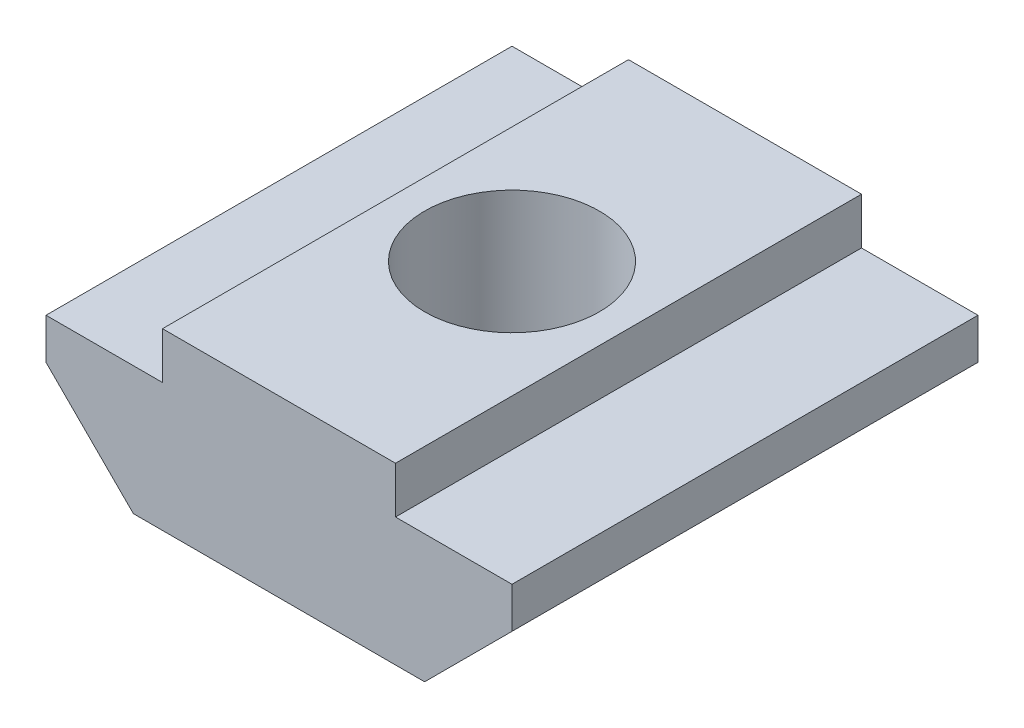
ISO-10303-21;
HEADER;
FILE_DESCRIPTION(('STEP AP214'),'2;1');
FILE_NAME('part.step','',(''),(''),'','','');
FILE_SCHEMA(('AUTOMOTIVE_DESIGN { 1 0 10303 214 1 1 1 1 }'));
ENDSEC;
DATA;
#1=APPLICATION_CONTEXT('core data for automotive mechanical design processes');
#2=APPLICATION_PROTOCOL_DEFINITION('international standard','automotive_design',2000,#1);
#3=PRODUCT_CONTEXT('',#1,'mechanical');
#4=PRODUCT('Part','Part','',(#3));
#5=PRODUCT_RELATED_PRODUCT_CATEGORY('part','',(#4));
#6=PRODUCT_DEFINITION_FORMATION('','',#4);
#7=PRODUCT_DEFINITION_CONTEXT('part definition',#1,'design');
#8=PRODUCT_DEFINITION('design','',#6,#7);
#9=PRODUCT_DEFINITION_SHAPE('','',#8);
#10=(LENGTH_UNIT() NAMED_UNIT(*) SI_UNIT(.MILLI.,.METRE.));
#11=(NAMED_UNIT(*) PLANE_ANGLE_UNIT() SI_UNIT($,.RADIAN.));
#12=(NAMED_UNIT(*) SI_UNIT($,.STERADIAN.) SOLID_ANGLE_UNIT());
#13=UNCERTAINTY_MEASURE_WITH_UNIT(LENGTH_MEASURE(1.E-05),#10,'distance_accuracy_value','');
#14=(GEOMETRIC_REPRESENTATION_CONTEXT(3) GLOBAL_UNCERTAINTY_ASSIGNED_CONTEXT((#13)) GLOBAL_UNIT_ASSIGNED_CONTEXT((#10,
#11,#12)) REPRESENTATION_CONTEXT('',''));
#15=CARTESIAN_POINT('',(0.,0.,0.));
#16=DIRECTION('',(0.,0.,1.));
#17=DIRECTION('',(1.,0.,0.));
#18=AXIS2_PLACEMENT_3D('',#15,#16,#17);
#19=CARTESIAN_POINT('',(-5.00000000000001,-4.4,16.));
#20=DIRECTION('',(0.707106781186549,0.707106781186546,0.));
#21=DIRECTION('',(-0.707106781186546,0.707106781186549,0.));
#22=AXIS2_PLACEMENT_3D('',#19,#20,#21);
#23=PLANE('',#22);
#24=DIRECTION('',(0.707106781186546,-0.707106781186549,0.));
#25=VECTOR('',#24,1.);
#26=CARTESIAN_POINT('',(-5.00000000000001,-4.4,0.));
#27=LINE('',#26,#25);
#28=CARTESIAN_POINT('',(-8.,-1.4,0.));
#29=VERTEX_POINT('',#28);
#30=CARTESIAN_POINT('',(-5.00000000000001,-4.4,0.));
#31=VERTEX_POINT('',#30);
#32=EDGE_CURVE('E143',#29,#31,#27,.T.);
#33=ORIENTED_EDGE('',*,*,#32,.T.);
#34=DIRECTION('',(0.,0.,-1.));
#35=VECTOR('',#34,1.);
#36=CARTESIAN_POINT('',(-5.00000000000001,-4.4,16.));
#37=LINE('',#36,#35);
#38=CARTESIAN_POINT('',(-5.00000000000001,-4.4,16.));
#39=VERTEX_POINT('',#38);
#40=EDGE_CURVE('E11',#39,#31,#37,.T.);
#41=ORIENTED_EDGE('',*,*,#40,.F.);
#42=DIRECTION('',(0.707106781186546,-0.707106781186549,0.));
#43=VECTOR('',#42,1.);
#44=CARTESIAN_POINT('',(-5.00000000000001,-4.4,16.));
#45=LINE('',#44,#43);
#46=CARTESIAN_POINT('',(-8.,-1.4,16.));
#47=VERTEX_POINT('',#46);
#48=EDGE_CURVE('E162',#47,#39,#45,.T.);
#49=ORIENTED_EDGE('',*,*,#48,.F.);
#50=DIRECTION('',(0.,0.,-1.));
#51=VECTOR('',#50,1.);
#52=CARTESIAN_POINT('',(-8.,-1.4,16.));
#53=LINE('',#52,#51);
#54=EDGE_CURVE('E139',#47,#29,#53,.T.);
#55=ORIENTED_EDGE('',*,*,#54,.T.);
#56=EDGE_LOOP('',(#33,#41,#49,#55));
#57=FACE_BOUND('',#56,.T.);
#58=ADVANCED_FACE('F35',(#57),#23,.F.);
#59=CARTESIAN_POINT('',(5.00000000000001,-4.4,16.));
#60=DIRECTION('',(0.,1.,0.));
#61=DIRECTION('',(-1.,0.,0.));
#62=AXIS2_PLACEMENT_3D('',#59,#60,#61);
#63=PLANE('',#62);
#64=CARTESIAN_POINT('',(0.,-4.4,8.));
#65=DIRECTION('',(0.,1.,0.));
#66=DIRECTION('',(0.,0.,1.));
#67=AXIS2_PLACEMENT_3D('',#64,#65,#66);
#68=CIRCLE('',#67,3.);
#69=CARTESIAN_POINT('',(0.,-4.4,11.));
#70=VERTEX_POINT('',#69);
#71=EDGE_CURVE('E147',#70,#70,#68,.T.);
#72=ORIENTED_EDGE('',*,*,#71,.T.);
#73=EDGE_LOOP('',(#72));
#74=FACE_BOUND('',#73,.T.);
#75=DIRECTION('',(1.,0.,0.));
#76=VECTOR('',#75,1.);
#77=CARTESIAN_POINT('',(5.00000000000001,-4.4,0.));
#78=LINE('',#77,#76);
#79=CARTESIAN_POINT('',(5.00000000000001,-4.4,0.));
#80=VERTEX_POINT('',#79);
#81=EDGE_CURVE('E146',#31,#80,#78,.T.);
#82=ORIENTED_EDGE('',*,*,#81,.T.);
#83=DIRECTION('',(0.,0.,-1.));
#84=VECTOR('',#83,1.);
#85=CARTESIAN_POINT('',(5.00000000000001,-4.4,16.));
#86=LINE('',#85,#84);
#87=CARTESIAN_POINT('',(5.00000000000001,-4.4,16.));
#88=VERTEX_POINT('',#87);
#89=EDGE_CURVE('E43',#88,#80,#86,.T.);
#90=ORIENTED_EDGE('',*,*,#89,.F.);
#91=DIRECTION('',(1.,0.,0.));
#92=VECTOR('',#91,1.);
#93=CARTESIAN_POINT('',(5.00000000000001,-4.4,16.));
#94=LINE('',#93,#92);
#95=EDGE_CURVE('E100',#39,#88,#94,.T.);
#96=ORIENTED_EDGE('',*,*,#95,.F.);
#97=ORIENTED_EDGE('',*,*,#40,.T.);
#98=EDGE_LOOP('',(#82,#90,#96,#97));
#99=FACE_BOUND('',#98,.T.);
#100=ADVANCED_FACE('F238',(#74,#99),#63,.F.);
#101=CARTESIAN_POINT('',(5.00000000000001,-4.4,16.));
#102=DIRECTION('',(-0.707106781186549,0.707106781186546,0.));
#103=DIRECTION('',(-0.707106781186546,-0.707106781186549,0.));
#104=AXIS2_PLACEMENT_3D('',#101,#102,#103);
#105=PLANE('',#104);
#106=DIRECTION('',(0.707106781186546,0.707106781186549,0.));
#107=VECTOR('',#106,1.);
#108=CARTESIAN_POINT('',(5.00000000000001,-4.4,0.));
#109=LINE('',#108,#107);
#110=CARTESIAN_POINT('',(8.,-1.4,0.));
#111=VERTEX_POINT('',#110);
#112=EDGE_CURVE('E149',#80,#111,#109,.T.);
#113=ORIENTED_EDGE('',*,*,#112,.T.);
#114=DIRECTION('',(0.,0.,-1.));
#115=VECTOR('',#114,1.);
#116=CARTESIAN_POINT('',(8.,-1.4,16.));
#117=LINE('',#116,#115);
#118=CARTESIAN_POINT('',(8.,-1.4,16.));
#119=VERTEX_POINT('',#118);
#120=EDGE_CURVE('E175',#119,#111,#117,.T.);
#121=ORIENTED_EDGE('',*,*,#120,.F.);
#122=DIRECTION('',(0.707106781186546,0.707106781186549,0.));
#123=VECTOR('',#122,1.);
#124=CARTESIAN_POINT('',(5.00000000000001,-4.4,16.));
#125=LINE('',#124,#123);
#126=EDGE_CURVE('E183',#88,#119,#125,.T.);
#127=ORIENTED_EDGE('',*,*,#126,.F.);
#128=ORIENTED_EDGE('',*,*,#89,.T.);
#129=EDGE_LOOP('',(#113,#121,#127,#128));
#130=FACE_BOUND('',#129,.T.);
#131=ADVANCED_FACE('F181',(#130),#105,.F.);
#132=CARTESIAN_POINT('',(8.,-1.4,16.));
#133=DIRECTION('',(-1.,0.,0.));
#134=DIRECTION('',(0.,0.,1.));
#135=AXIS2_PLACEMENT_3D('',#132,#133,#134);
#136=PLANE('',#135);
#137=DIRECTION('',(0.,1.,0.));
#138=VECTOR('',#137,1.);
#139=CARTESIAN_POINT('',(8.,-1.4,0.));
#140=LINE('',#139,#138);
#141=CARTESIAN_POINT('',(8.,0.,0.));
#142=VERTEX_POINT('',#141);
#143=EDGE_CURVE('E151',#111,#142,#140,.T.);
#144=ORIENTED_EDGE('',*,*,#143,.T.);
#145=DIRECTION('',(0.,0.,-1.));
#146=VECTOR('',#145,1.);
#147=CARTESIAN_POINT('',(8.,0.,16.));
#148=LINE('',#147,#146);
#149=CARTESIAN_POINT('',(8.,0.,16.));
#150=VERTEX_POINT('',#149);
#151=EDGE_CURVE('E172',#150,#142,#148,.T.);
#152=ORIENTED_EDGE('',*,*,#151,.F.);
#153=DIRECTION('',(0.,1.,0.));
#154=VECTOR('',#153,1.);
#155=CARTESIAN_POINT('',(8.,-1.4,16.));
#156=LINE('',#155,#154);
#157=EDGE_CURVE('E201',#119,#150,#156,.T.);
#158=ORIENTED_EDGE('',*,*,#157,.F.);
#159=ORIENTED_EDGE('',*,*,#120,.T.);
#160=EDGE_LOOP('',(#144,#152,#158,#159));
#161=FACE_BOUND('',#160,.T.);
#162=ADVANCED_FACE('F192',(#161),#136,.F.);
#163=CARTESIAN_POINT('',(8.,0.,16.));
#164=DIRECTION('',(0.,-1.,0.));
#165=DIRECTION('',(1.,0.,0.));
#166=AXIS2_PLACEMENT_3D('',#163,#164,#165);
#167=PLANE('',#166);
#168=DIRECTION('',(-1.,0.,0.));
#169=VECTOR('',#168,1.);
#170=CARTESIAN_POINT('',(8.,0.,0.));
#171=LINE('',#170,#169);
#172=CARTESIAN_POINT('',(4.,0.,0.));
#173=VERTEX_POINT('',#172);
#174=EDGE_CURVE('E153',#142,#173,#171,.T.);
#175=ORIENTED_EDGE('',*,*,#174,.T.);
#176=DIRECTION('',(0.,0.,-1.));
#177=VECTOR('',#176,1.);
#178=CARTESIAN_POINT('',(4.,0.,16.));
#179=LINE('',#178,#177);
#180=CARTESIAN_POINT('',(4.,0.,16.));
#181=VERTEX_POINT('',#180);
#182=EDGE_CURVE('E169',#181,#173,#179,.T.);
#183=ORIENTED_EDGE('',*,*,#182,.F.);
#184=DIRECTION('',(-1.,0.,0.));
#185=VECTOR('',#184,1.);
#186=CARTESIAN_POINT('',(8.,0.,16.));
#187=LINE('',#186,#185);
#188=EDGE_CURVE('E198',#150,#181,#187,.T.);
#189=ORIENTED_EDGE('',*,*,#188,.F.);
#190=ORIENTED_EDGE('',*,*,#151,.T.);
#191=EDGE_LOOP('',(#175,#183,#189,#190));
#192=FACE_BOUND('',#191,.T.);
#193=ADVANCED_FACE('F196',(#192),#167,.F.);
#194=CARTESIAN_POINT('',(4.,0.,16.));
#195=DIRECTION('',(-1.,0.,0.));
#196=DIRECTION('',(0.,-1.,0.));
#197=AXIS2_PLACEMENT_3D('',#194,#195,#196);
#198=PLANE('',#197);
#199=DIRECTION('',(0.,1.,0.));
#200=VECTOR('',#199,1.);
#201=CARTESIAN_POINT('',(4.,0.,0.));
#202=LINE('',#201,#200);
#203=CARTESIAN_POINT('',(4.,1.6,0.));
#204=VERTEX_POINT('',#203);
#205=EDGE_CURVE('E155',#173,#204,#202,.T.);
#206=ORIENTED_EDGE('',*,*,#205,.T.);
#207=DIRECTION('',(0.,0.,-1.));
#208=VECTOR('',#207,1.);
#209=CARTESIAN_POINT('',(4.,1.6,16.));
#210=LINE('',#209,#208);
#211=CARTESIAN_POINT('',(4.,1.6,16.));
#212=VERTEX_POINT('',#211);
#213=EDGE_CURVE('E166',#212,#204,#210,.T.);
#214=ORIENTED_EDGE('',*,*,#213,.F.);
#215=DIRECTION('',(0.,1.,0.));
#216=VECTOR('',#215,1.);
#217=CARTESIAN_POINT('',(4.,0.,16.));
#218=LINE('',#217,#216);
#219=EDGE_CURVE('E200',#181,#212,#218,.T.);
#220=ORIENTED_EDGE('',*,*,#219,.F.);
#221=ORIENTED_EDGE('',*,*,#182,.T.);
#222=EDGE_LOOP('',(#206,#214,#220,#221));
#223=FACE_BOUND('',#222,.T.);
#224=ADVANCED_FACE('F220',(#223),#198,.F.);
#225=CARTESIAN_POINT('',(-4.,1.6,16.));
#226=DIRECTION('',(0.,-1.,0.));
#227=DIRECTION('',(1.,0.,0.));
#228=AXIS2_PLACEMENT_3D('',#225,#226,#227);
#229=PLANE('',#228);
#230=CARTESIAN_POINT('',(0.,1.6,8.));
#231=DIRECTION('',(0.,1.,0.));
#232=DIRECTION('',(0.,0.,1.));
#233=AXIS2_PLACEMENT_3D('',#230,#231,#232);
#234=CIRCLE('',#233,3.);
#235=CARTESIAN_POINT('',(0.,1.6,11.));
#236=VERTEX_POINT('',#235);
#237=EDGE_CURVE('E211',#236,#236,#234,.T.);
#238=ORIENTED_EDGE('',*,*,#237,.F.);
#239=EDGE_LOOP('',(#238));
#240=FACE_BOUND('',#239,.T.);
#241=DIRECTION('',(-1.,0.,0.));
#242=VECTOR('',#241,1.);
#243=CARTESIAN_POINT('',(-4.,1.6,0.));
#244=LINE('',#243,#242);
#245=CARTESIAN_POINT('',(-4.,1.6,0.));
#246=VERTEX_POINT('',#245);
#247=EDGE_CURVE('E157',#204,#246,#244,.T.);
#248=ORIENTED_EDGE('',*,*,#247,.T.);
#249=DIRECTION('',(0.,0.,-1.));
#250=VECTOR('',#249,1.);
#251=CARTESIAN_POINT('',(-4.,1.6,16.));
#252=LINE('',#251,#250);
#253=CARTESIAN_POINT('',(-4.,1.6,16.));
#254=VERTEX_POINT('',#253);
#255=EDGE_CURVE('E134',#254,#246,#252,.T.);
#256=ORIENTED_EDGE('',*,*,#255,.F.);
#257=DIRECTION('',(-1.,0.,0.));
#258=VECTOR('',#257,1.);
#259=CARTESIAN_POINT('',(-4.,1.6,16.));
#260=LINE('',#259,#258);
#261=EDGE_CURVE('E125',#212,#254,#260,.T.);
#262=ORIENTED_EDGE('',*,*,#261,.F.);
#263=ORIENTED_EDGE('',*,*,#213,.T.);
#264=EDGE_LOOP('',(#248,#256,#262,#263));
#265=FACE_BOUND('',#264,.T.);
#266=ADVANCED_FACE('F217',(#240,#265),#229,.F.);
#267=CARTESIAN_POINT('',(-4.,0.,16.));
#268=DIRECTION('',(1.,0.,0.));
#269=DIRECTION('',(0.,0.,-1.));
#270=AXIS2_PLACEMENT_3D('',#267,#268,#269);
#271=PLANE('',#270);
#272=DIRECTION('',(0.,-1.,0.));
#273=VECTOR('',#272,1.);
#274=CARTESIAN_POINT('',(-4.,0.,0.));
#275=LINE('',#274,#273);
#276=CARTESIAN_POINT('',(-4.,0.,0.));
#277=VERTEX_POINT('',#276);
#278=EDGE_CURVE('E133',#246,#277,#275,.T.);
#279=ORIENTED_EDGE('',*,*,#278,.T.);
#280=DIRECTION('',(0.,0.,-1.));
#281=VECTOR('',#280,1.);
#282=CARTESIAN_POINT('',(-4.,0.,16.));
#283=LINE('',#282,#281);
#284=CARTESIAN_POINT('',(-4.,0.,16.));
#285=VERTEX_POINT('',#284);
#286=EDGE_CURVE('E130',#285,#277,#283,.T.);
#287=ORIENTED_EDGE('',*,*,#286,.F.);
#288=DIRECTION('',(0.,-1.,0.));
#289=VECTOR('',#288,1.);
#290=CARTESIAN_POINT('',(-4.,0.,16.));
#291=LINE('',#290,#289);
#292=EDGE_CURVE('E119',#254,#285,#291,.T.);
#293=ORIENTED_EDGE('',*,*,#292,.F.);
#294=ORIENTED_EDGE('',*,*,#255,.T.);
#295=EDGE_LOOP('',(#279,#287,#293,#294));
#296=FACE_BOUND('',#295,.T.);
#297=ADVANCED_FACE('F131',(#296),#271,.F.);
#298=CARTESIAN_POINT('',(-8.,0.,16.));
#299=DIRECTION('',(0.,-1.,0.));
#300=DIRECTION('',(0.,0.,-1.));
#301=AXIS2_PLACEMENT_3D('',#298,#299,#300);
#302=PLANE('',#301);
#303=DIRECTION('',(-1.,0.,0.));
#304=VECTOR('',#303,1.);
#305=CARTESIAN_POINT('',(-8.,0.,0.));
#306=LINE('',#305,#304);
#307=CARTESIAN_POINT('',(-8.,0.,0.));
#308=VERTEX_POINT('',#307);
#309=EDGE_CURVE('E86',#277,#308,#306,.T.);
#310=ORIENTED_EDGE('',*,*,#309,.T.);
#311=DIRECTION('',(0.,0.,-1.));
#312=VECTOR('',#311,1.);
#313=CARTESIAN_POINT('',(-8.,0.,16.));
#314=LINE('',#313,#312);
#315=CARTESIAN_POINT('',(-8.,0.,16.));
#316=VERTEX_POINT('',#315);
#317=EDGE_CURVE('E135',#316,#308,#314,.T.);
#318=ORIENTED_EDGE('',*,*,#317,.F.);
#319=DIRECTION('',(-1.,0.,0.));
#320=VECTOR('',#319,1.);
#321=CARTESIAN_POINT('',(-8.,0.,16.));
#322=LINE('',#321,#320);
#323=EDGE_CURVE('E123',#285,#316,#322,.T.);
#324=ORIENTED_EDGE('',*,*,#323,.F.);
#325=ORIENTED_EDGE('',*,*,#286,.T.);
#326=EDGE_LOOP('',(#310,#318,#324,#325));
#327=FACE_BOUND('',#326,.T.);
#328=ADVANCED_FACE('F137',(#327),#302,.F.);
#329=CARTESIAN_POINT('',(-8.,-1.4,16.));
#330=DIRECTION('',(1.,0.,0.));
#331=DIRECTION('',(0.,0.,-1.));
#332=AXIS2_PLACEMENT_3D('',#329,#330,#331);
#333=PLANE('',#332);
#334=DIRECTION('',(0.,-1.,0.));
#335=VECTOR('',#334,1.);
#336=CARTESIAN_POINT('',(-8.,-1.4,0.));
#337=LINE('',#336,#335);
#338=EDGE_CURVE('E92',#308,#29,#337,.T.);
#339=ORIENTED_EDGE('',*,*,#338,.T.);
#340=ORIENTED_EDGE('',*,*,#54,.F.);
#341=DIRECTION('',(0.,-1.,0.));
#342=VECTOR('',#341,1.);
#343=CARTESIAN_POINT('',(-8.,-1.4,16.));
#344=LINE('',#343,#342);
#345=EDGE_CURVE('E51',#316,#47,#344,.T.);
#346=ORIENTED_EDGE('',*,*,#345,.F.);
#347=ORIENTED_EDGE('',*,*,#317,.T.);
#348=EDGE_LOOP('',(#339,#340,#346,#347));
#349=FACE_BOUND('',#348,.T.);
#350=ADVANCED_FACE('F227',(#349),#333,.F.);
#351=CARTESIAN_POINT('',(0.,0.,16.));
#352=DIRECTION('',(0.,0.,-1.));
#353=DIRECTION('',(-1.,0.,0.));
#354=AXIS2_PLACEMENT_3D('',#351,#352,#353);
#355=PLANE('',#354);
#356=ORIENTED_EDGE('',*,*,#48,.T.);
#357=ORIENTED_EDGE('',*,*,#95,.T.);
#358=ORIENTED_EDGE('',*,*,#126,.T.);
#359=ORIENTED_EDGE('',*,*,#157,.T.);
#360=ORIENTED_EDGE('',*,*,#188,.T.);
#361=ORIENTED_EDGE('',*,*,#219,.T.);
#362=ORIENTED_EDGE('',*,*,#261,.T.);
#363=ORIENTED_EDGE('',*,*,#292,.T.);
#364=ORIENTED_EDGE('',*,*,#323,.T.);
#365=ORIENTED_EDGE('',*,*,#345,.T.);
#366=EDGE_LOOP('',(#356,#357,#358,#359,#360,#361,#362,#363,#364,#365));
#367=FACE_BOUND('',#366,.T.);
#368=ADVANCED_FACE('F121',(#367),#355,.F.);
#369=CARTESIAN_POINT('',(0.,0.,0.));
#370=DIRECTION('',(0.,0.,-1.));
#371=DIRECTION('',(-1.,0.,0.));
#372=AXIS2_PLACEMENT_3D('',#369,#370,#371);
#373=PLANE('',#372);
#374=ORIENTED_EDGE('',*,*,#32,.F.);
#375=ORIENTED_EDGE('',*,*,#338,.F.);
#376=ORIENTED_EDGE('',*,*,#309,.F.);
#377=ORIENTED_EDGE('',*,*,#278,.F.);
#378=ORIENTED_EDGE('',*,*,#247,.F.);
#379=ORIENTED_EDGE('',*,*,#205,.F.);
#380=ORIENTED_EDGE('',*,*,#174,.F.);
#381=ORIENTED_EDGE('',*,*,#143,.F.);
#382=ORIENTED_EDGE('',*,*,#112,.F.);
#383=ORIENTED_EDGE('',*,*,#81,.F.);
#384=EDGE_LOOP('',(#374,#375,#376,#377,#378,#379,#380,#381,#382,#383));
#385=FACE_BOUND('',#384,.T.);
#386=ADVANCED_FACE('F187',(#385),#373,.T.);
#387=CARTESIAN_POINT('',(0.,-4.4,8.));
#388=DIRECTION('',(0.,1.,0.));
#389=DIRECTION('',(0.,0.,1.));
#390=AXIS2_PLACEMENT_3D('',#387,#388,#389);
#391=CYLINDRICAL_SURFACE('',#390,3.);
#392=ORIENTED_EDGE('',*,*,#71,.F.);
#393=EDGE_LOOP('',(#392));
#394=FACE_BOUND('',#393,.T.);
#395=ORIENTED_EDGE('',*,*,#237,.T.);
#396=EDGE_LOOP('',(#395));
#397=FACE_BOUND('',#396,.T.);
#398=ADVANCED_FACE('F215',(#394,#397),#391,.F.);
#399=CLOSED_SHELL('',(#58,#100,#131,#162,#193,#224,#266,#297,#328,#350,#368,#386,#398));
#400=MANIFOLD_SOLID_BREP('B2',#399);
#401=ADVANCED_BREP_SHAPE_REPRESENTATION('',(#18,#400),#14);
#402=SHAPE_DEFINITION_REPRESENTATION(#9,#401);
ENDSEC;
END-ISO-10303-21;
